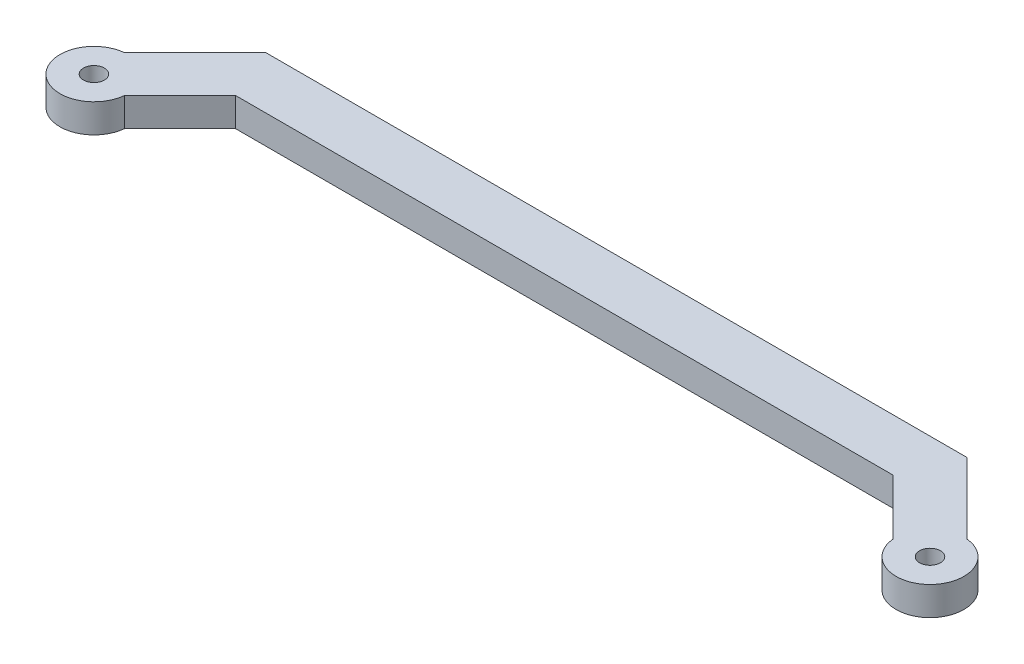
ISO-10303-21;
HEADER;
FILE_DESCRIPTION(('STEP AP214'),'2;1');
FILE_NAME('part.step','',(''),(''),'','','');
FILE_SCHEMA(('AUTOMOTIVE_DESIGN { 1 0 10303 214 1 1 1 1 }'));
ENDSEC;
DATA;
#1=APPLICATION_CONTEXT('core data for automotive mechanical design processes');
#2=APPLICATION_PROTOCOL_DEFINITION('international standard','automotive_design',2000,#1);
#3=PRODUCT_CONTEXT('',#1,'mechanical');
#4=PRODUCT('Part','Part','',(#3));
#5=PRODUCT_RELATED_PRODUCT_CATEGORY('part','',(#4));
#6=PRODUCT_DEFINITION_FORMATION('','',#4);
#7=PRODUCT_DEFINITION_CONTEXT('part definition',#1,'design');
#8=PRODUCT_DEFINITION('design','',#6,#7);
#9=PRODUCT_DEFINITION_SHAPE('','',#8);
#10=(LENGTH_UNIT() NAMED_UNIT(*) SI_UNIT(.MILLI.,.METRE.));
#11=(NAMED_UNIT(*) PLANE_ANGLE_UNIT() SI_UNIT($,.RADIAN.));
#12=(NAMED_UNIT(*) SI_UNIT($,.STERADIAN.) SOLID_ANGLE_UNIT());
#13=UNCERTAINTY_MEASURE_WITH_UNIT(LENGTH_MEASURE(1.E-05),#10,'distance_accuracy_value','');
#14=(GEOMETRIC_REPRESENTATION_CONTEXT(3) GLOBAL_UNCERTAINTY_ASSIGNED_CONTEXT((#13)) GLOBAL_UNIT_ASSIGNED_CONTEXT((#10,
#11,#12)) REPRESENTATION_CONTEXT('',''));
#15=CARTESIAN_POINT('',(0.,0.,0.));
#16=DIRECTION('',(0.,0.,1.));
#17=DIRECTION('',(1.,0.,0.));
#18=AXIS2_PLACEMENT_3D('',#15,#16,#17);
#19=CARTESIAN_POINT('',(-80.,5.5,10.));
#20=DIRECTION('',(0.,-1.,0.));
#21=DIRECTION('',(0.,0.,-1.));
#22=AXIS2_PLACEMENT_3D('',#19,#20,#21);
#23=PLANE('',#22);
#24=CARTESIAN_POINT('',(-80.,5.5,10.));
#25=DIRECTION('',(0.,-1.,0.));
#26=DIRECTION('',(0.,0.,-1.));
#27=AXIS2_PLACEMENT_3D('',#24,#25,#26);
#28=CIRCLE('',#27,2.);
#29=CARTESIAN_POINT('',(-80.,5.5,8.00000000000001));
#30=VERTEX_POINT('',#29);
#31=EDGE_CURVE('E191',#30,#30,#28,.T.);
#32=ORIENTED_EDGE('',*,*,#31,.T.);
#33=EDGE_LOOP('',(#32));
#34=FACE_BOUND('',#33,.T.);
#35=DIRECTION('',(-0.707106781186546,0.,0.707106781186549));
#36=VECTOR('',#35,1.);
#37=CARTESIAN_POINT('',(-62.9289321881346,5.5,0.));
#38=LINE('',#37,#36);
#39=CARTESIAN_POINT('',(-62.9289321881346,5.5,0.));
#40=VERTEX_POINT('',#39);
#41=CARTESIAN_POINT('',(-73.5276310629496,5.5,10.598698874815));
#42=VERTEX_POINT('',#41);
#43=EDGE_CURVE('E205',#40,#42,#38,.T.);
#44=ORIENTED_EDGE('',*,*,#43,.F.);
#45=DIRECTION('',(1.,0.,0.));
#46=VECTOR('',#45,1.);
#47=CARTESIAN_POINT('',(-62.9289321881346,5.5,0.));
#48=LINE('',#47,#46);
#49=CARTESIAN_POINT('',(62.9289321881346,5.5,0.));
#50=VERTEX_POINT('',#49);
#51=EDGE_CURVE('E165',#40,#50,#48,.T.);
#52=ORIENTED_EDGE('',*,*,#51,.T.);
#53=DIRECTION('',(0.707106781186546,0.,0.707106781186549));
#54=VECTOR('',#53,1.);
#55=CARTESIAN_POINT('',(62.9289321881346,5.5,0.));
#56=LINE('',#55,#54);
#57=CARTESIAN_POINT('',(73.5276310629496,5.5,10.598698874815));
#58=VERTEX_POINT('',#57);
#59=EDGE_CURVE('E157',#50,#58,#56,.T.);
#60=ORIENTED_EDGE('',*,*,#59,.T.);
#61=CARTESIAN_POINT('',(80.,5.5,9.99999999999999));
#62=DIRECTION('',(0.,1.,0.));
#63=DIRECTION('',(0.,0.,1.));
#64=AXIS2_PLACEMENT_3D('',#61,#62,#63);
#65=CIRCLE('',#64,6.5);
#66=CARTESIAN_POINT('',(80.5986988748151,5.5,3.52763106294957));
#67=VERTEX_POINT('',#66);
#68=EDGE_CURVE('E163',#58,#67,#65,.T.);
#69=ORIENTED_EDGE('',*,*,#68,.T.);
#70=DIRECTION('',(0.707106781186547,0.,0.707106781186548));
#71=VECTOR('',#70,1.);
#72=CARTESIAN_POINT('',(67.0710678118655,5.5,-10.));
#73=LINE('',#72,#71);
#74=CARTESIAN_POINT('',(67.0710678118655,5.5,-10.));
#75=VERTEX_POINT('',#74);
#76=EDGE_CURVE('E180',#75,#67,#73,.T.);
#77=ORIENTED_EDGE('',*,*,#76,.F.);
#78=DIRECTION('',(-1.,0.,0.));
#79=VECTOR('',#78,1.);
#80=CARTESIAN_POINT('',(67.0710678118655,5.5,-10.));
#81=LINE('',#80,#79);
#82=CARTESIAN_POINT('',(-67.0710678118655,5.5,-9.99999999999999));
#83=VERTEX_POINT('',#82);
#84=EDGE_CURVE('E182',#75,#83,#81,.T.);
#85=ORIENTED_EDGE('',*,*,#84,.T.);
#86=DIRECTION('',(-0.707106781186547,0.,0.707106781186548));
#87=VECTOR('',#86,1.);
#88=CARTESIAN_POINT('',(-67.0710678118655,5.5,-9.99999999999999));
#89=LINE('',#88,#87);
#90=CARTESIAN_POINT('',(-80.5986988748151,5.5,3.52763106294959));
#91=VERTEX_POINT('',#90);
#92=EDGE_CURVE('E227',#83,#91,#89,.T.);
#93=ORIENTED_EDGE('',*,*,#92,.T.);
#94=CARTESIAN_POINT('',(-80.,5.5,10.));
#95=DIRECTION('',(0.,-1.,0.));
#96=DIRECTION('',(0.,0.,-1.));
#97=AXIS2_PLACEMENT_3D('',#94,#95,#96);
#98=CIRCLE('',#97,6.5);
#99=EDGE_CURVE('E232',#42,#91,#98,.T.);
#100=ORIENTED_EDGE('',*,*,#99,.F.);
#101=EDGE_LOOP('',(#44,#52,#60,#69,#77,#85,#93,#100));
#102=FACE_BOUND('',#101,.T.);
#103=CARTESIAN_POINT('',(80.,5.5,9.99999999999999));
#104=DIRECTION('',(0.,1.,0.));
#105=DIRECTION('',(0.,0.,1.));
#106=AXIS2_PLACEMENT_3D('',#103,#104,#105);
#107=CIRCLE('',#106,2.);
#108=CARTESIAN_POINT('',(80.,5.5,12.));
#109=VERTEX_POINT('',#108);
#110=EDGE_CURVE('E240',#109,#109,#107,.T.);
#111=ORIENTED_EDGE('',*,*,#110,.F.);
#112=EDGE_LOOP('',(#111));
#113=FACE_BOUND('',#112,.T.);
#114=ADVANCED_FACE('F87',(#34,#102,#113),#23,.F.);
#115=CARTESIAN_POINT('',(-80.,0.,10.));
#116=DIRECTION('',(0.,-1.,0.));
#117=DIRECTION('',(0.,0.,-1.));
#118=AXIS2_PLACEMENT_3D('',#115,#116,#117);
#119=PLANE('',#118);
#120=DIRECTION('',(-0.707106781186546,0.,0.707106781186549));
#121=VECTOR('',#120,1.);
#122=CARTESIAN_POINT('',(-62.9289321881346,0.,0.));
#123=LINE('',#122,#121);
#124=CARTESIAN_POINT('',(-62.9289321881346,0.,0.));
#125=VERTEX_POINT('',#124);
#126=CARTESIAN_POINT('',(-73.5276310629496,0.,10.598698874815));
#127=VERTEX_POINT('',#126);
#128=EDGE_CURVE('E187',#125,#127,#123,.T.);
#129=ORIENTED_EDGE('',*,*,#128,.T.);
#130=CARTESIAN_POINT('',(-80.,0.,10.));
#131=DIRECTION('',(0.,-1.,0.));
#132=DIRECTION('',(0.,0.,-1.));
#133=AXIS2_PLACEMENT_3D('',#130,#131,#132);
#134=CIRCLE('',#133,6.5);
#135=CARTESIAN_POINT('',(-80.5986988748151,0.,3.52763106294959));
#136=VERTEX_POINT('',#135);
#137=EDGE_CURVE('E190',#127,#136,#134,.T.);
#138=ORIENTED_EDGE('',*,*,#137,.T.);
#139=DIRECTION('',(-0.707106781186547,0.,0.707106781186548));
#140=VECTOR('',#139,1.);
#141=CARTESIAN_POINT('',(-67.0710678118655,0.,-9.99999999999999));
#142=LINE('',#141,#140);
#143=CARTESIAN_POINT('',(-67.0710678118655,0.,-9.99999999999999));
#144=VERTEX_POINT('',#143);
#145=EDGE_CURVE('E194',#144,#136,#142,.T.);
#146=ORIENTED_EDGE('',*,*,#145,.F.);
#147=DIRECTION('',(-1.,0.,0.));
#148=VECTOR('',#147,1.);
#149=CARTESIAN_POINT('',(67.0710678118655,0.,-10.));
#150=LINE('',#149,#148);
#151=CARTESIAN_POINT('',(67.0710678118655,0.,-10.));
#152=VERTEX_POINT('',#151);
#153=EDGE_CURVE('E197',#152,#144,#150,.T.);
#154=ORIENTED_EDGE('',*,*,#153,.F.);
#155=DIRECTION('',(0.707106781186547,0.,0.707106781186548));
#156=VECTOR('',#155,1.);
#157=CARTESIAN_POINT('',(67.0710678118655,0.,-10.));
#158=LINE('',#157,#156);
#159=CARTESIAN_POINT('',(80.5986988748151,0.,3.52763106294957));
#160=VERTEX_POINT('',#159);
#161=EDGE_CURVE('E199',#152,#160,#158,.T.);
#162=ORIENTED_EDGE('',*,*,#161,.T.);
#163=CARTESIAN_POINT('',(80.,0.,9.99999999999999));
#164=DIRECTION('',(0.,1.,0.));
#165=DIRECTION('',(0.,0.,1.));
#166=AXIS2_PLACEMENT_3D('',#163,#164,#165);
#167=CIRCLE('',#166,6.5);
#168=CARTESIAN_POINT('',(73.5276310629496,0.,10.598698874815));
#169=VERTEX_POINT('',#168);
#170=EDGE_CURVE('E202',#169,#160,#167,.T.);
#171=ORIENTED_EDGE('',*,*,#170,.F.);
#172=DIRECTION('',(0.707106781186546,0.,0.707106781186549));
#173=VECTOR('',#172,1.);
#174=CARTESIAN_POINT('',(62.9289321881346,0.,0.));
#175=LINE('',#174,#173);
#176=CARTESIAN_POINT('',(62.9289321881346,0.,0.));
#177=VERTEX_POINT('',#176);
#178=EDGE_CURVE('E172',#177,#169,#175,.T.);
#179=ORIENTED_EDGE('',*,*,#178,.F.);
#180=DIRECTION('',(1.,0.,0.));
#181=VECTOR('',#180,1.);
#182=CARTESIAN_POINT('',(-62.9289321881346,0.,0.));
#183=LINE('',#182,#181);
#184=EDGE_CURVE('E133',#125,#177,#183,.T.);
#185=ORIENTED_EDGE('',*,*,#184,.F.);
#186=EDGE_LOOP('',(#129,#138,#146,#154,#162,#171,#179,#185));
#187=FACE_BOUND('',#186,.T.);
#188=CARTESIAN_POINT('',(-80.,0.,10.));
#189=DIRECTION('',(0.,-1.,0.));
#190=DIRECTION('',(0.,0.,-1.));
#191=AXIS2_PLACEMENT_3D('',#188,#189,#190);
#192=CIRCLE('',#191,2.);
#193=CARTESIAN_POINT('',(-80.,0.,8.00000000000001));
#194=VERTEX_POINT('',#193);
#195=EDGE_CURVE('E237',#194,#194,#192,.T.);
#196=ORIENTED_EDGE('',*,*,#195,.F.);
#197=EDGE_LOOP('',(#196));
#198=FACE_BOUND('',#197,.T.);
#199=CARTESIAN_POINT('',(80.,0.,9.99999999999999));
#200=DIRECTION('',(0.,1.,0.));
#201=DIRECTION('',(0.,0.,1.));
#202=AXIS2_PLACEMENT_3D('',#199,#200,#201);
#203=CIRCLE('',#202,2.);
#204=CARTESIAN_POINT('',(80.,0.,12.));
#205=VERTEX_POINT('',#204);
#206=EDGE_CURVE('E243',#205,#205,#203,.T.);
#207=ORIENTED_EDGE('',*,*,#206,.T.);
#208=EDGE_LOOP('',(#207));
#209=FACE_BOUND('',#208,.T.);
#210=ADVANCED_FACE('F218',(#187,#198,#209),#119,.T.);
#211=CARTESIAN_POINT('',(-62.9289321881346,5.5,0.));
#212=DIRECTION('',(0.707106781186549,0.,0.707106781186546));
#213=DIRECTION('',(0.707106781186546,0.,-0.707106781186549));
#214=AXIS2_PLACEMENT_3D('',#211,#212,#213);
#215=PLANE('',#214);
#216=ORIENTED_EDGE('',*,*,#128,.F.);
#217=DIRECTION('',(0.,-1.,0.));
#218=VECTOR('',#217,1.);
#219=CARTESIAN_POINT('',(-62.9289321881346,5.5,0.));
#220=LINE('',#219,#218);
#221=EDGE_CURVE('E12',#40,#125,#220,.T.);
#222=ORIENTED_EDGE('',*,*,#221,.F.);
#223=ORIENTED_EDGE('',*,*,#43,.T.);
#224=DIRECTION('',(0.,-1.,0.));
#225=VECTOR('',#224,1.);
#226=CARTESIAN_POINT('',(-73.5276310629496,5.5,10.598698874815));
#227=LINE('',#226,#225);
#228=EDGE_CURVE('E91',#42,#127,#227,.T.);
#229=ORIENTED_EDGE('',*,*,#228,.T.);
#230=EDGE_LOOP('',(#216,#222,#223,#229));
#231=FACE_BOUND('',#230,.T.);
#232=ADVANCED_FACE('F89',(#231),#215,.T.);
#233=CARTESIAN_POINT('',(-62.9289321881346,5.5,0.));
#234=DIRECTION('',(0.,0.,-1.));
#235=DIRECTION('',(-1.,0.,0.));
#236=AXIS2_PLACEMENT_3D('',#233,#234,#235);
#237=PLANE('',#236);
#238=ORIENTED_EDGE('',*,*,#184,.T.);
#239=DIRECTION('',(0.,-1.,0.));
#240=VECTOR('',#239,1.);
#241=CARTESIAN_POINT('',(62.9289321881346,5.5,0.));
#242=LINE('',#241,#240);
#243=EDGE_CURVE('E97',#50,#177,#242,.T.);
#244=ORIENTED_EDGE('',*,*,#243,.F.);
#245=ORIENTED_EDGE('',*,*,#51,.F.);
#246=ORIENTED_EDGE('',*,*,#221,.T.);
#247=EDGE_LOOP('',(#238,#244,#245,#246));
#248=FACE_BOUND('',#247,.T.);
#249=ADVANCED_FACE('F262',(#248),#237,.F.);
#250=CARTESIAN_POINT('',(62.9289321881346,5.5,0.));
#251=DIRECTION('',(0.707106781186549,0.,-0.707106781186546));
#252=DIRECTION('',(-0.707106781186546,0.,-0.707106781186549));
#253=AXIS2_PLACEMENT_3D('',#250,#251,#252);
#254=PLANE('',#253);
#255=ORIENTED_EDGE('',*,*,#178,.T.);
#256=DIRECTION('',(0.,-1.,0.));
#257=VECTOR('',#256,1.);
#258=CARTESIAN_POINT('',(73.5276310629496,5.5,10.598698874815));
#259=LINE('',#258,#257);
#260=EDGE_CURVE('E169',#58,#169,#259,.T.);
#261=ORIENTED_EDGE('',*,*,#260,.F.);
#262=ORIENTED_EDGE('',*,*,#59,.F.);
#263=ORIENTED_EDGE('',*,*,#243,.T.);
#264=EDGE_LOOP('',(#255,#261,#262,#263));
#265=FACE_BOUND('',#264,.T.);
#266=ADVANCED_FACE('F170',(#265),#254,.F.);
#267=CARTESIAN_POINT('',(80.,5.5,9.99999999999999));
#268=DIRECTION('',(0.,-1.,0.));
#269=DIRECTION('',(0.,0.,-1.));
#270=AXIS2_PLACEMENT_3D('',#267,#268,#269);
#271=CYLINDRICAL_SURFACE('',#270,6.5);
#272=ORIENTED_EDGE('',*,*,#170,.T.);
#273=DIRECTION('',(0.,-1.,0.));
#274=VECTOR('',#273,1.);
#275=CARTESIAN_POINT('',(80.5986988748151,5.5,3.52763106294957));
#276=LINE('',#275,#274);
#277=EDGE_CURVE('E176',#67,#160,#276,.T.);
#278=ORIENTED_EDGE('',*,*,#277,.F.);
#279=ORIENTED_EDGE('',*,*,#68,.F.);
#280=ORIENTED_EDGE('',*,*,#260,.T.);
#281=EDGE_LOOP('',(#272,#278,#279,#280));
#282=FACE_BOUND('',#281,.T.);
#283=ADVANCED_FACE('F178',(#282),#271,.T.);
#284=CARTESIAN_POINT('',(67.0710678118655,5.5,-10.));
#285=DIRECTION('',(0.707106781186548,0.,-0.707106781186547));
#286=DIRECTION('',(-0.707106781186547,0.,-0.707106781186548));
#287=AXIS2_PLACEMENT_3D('',#284,#285,#286);
#288=PLANE('',#287);
#289=ORIENTED_EDGE('',*,*,#161,.F.);
#290=DIRECTION('',(0.,-1.,0.));
#291=VECTOR('',#290,1.);
#292=CARTESIAN_POINT('',(67.0710678118655,5.5,-10.));
#293=LINE('',#292,#291);
#294=EDGE_CURVE('E209',#75,#152,#293,.T.);
#295=ORIENTED_EDGE('',*,*,#294,.F.);
#296=ORIENTED_EDGE('',*,*,#76,.T.);
#297=ORIENTED_EDGE('',*,*,#277,.T.);
#298=EDGE_LOOP('',(#289,#295,#296,#297));
#299=FACE_BOUND('',#298,.T.);
#300=ADVANCED_FACE('F223',(#299),#288,.T.);
#301=CARTESIAN_POINT('',(67.0710678118655,5.5,-10.));
#302=DIRECTION('',(0.,0.,1.));
#303=DIRECTION('',(1.,0.,0.));
#304=AXIS2_PLACEMENT_3D('',#301,#302,#303);
#305=PLANE('',#304);
#306=ORIENTED_EDGE('',*,*,#153,.T.);
#307=DIRECTION('',(0.,-1.,0.));
#308=VECTOR('',#307,1.);
#309=CARTESIAN_POINT('',(-67.0710678118655,5.5,-9.99999999999999));
#310=LINE('',#309,#308);
#311=EDGE_CURVE('E211',#83,#144,#310,.T.);
#312=ORIENTED_EDGE('',*,*,#311,.F.);
#313=ORIENTED_EDGE('',*,*,#84,.F.);
#314=ORIENTED_EDGE('',*,*,#294,.T.);
#315=EDGE_LOOP('',(#306,#312,#313,#314));
#316=FACE_BOUND('',#315,.T.);
#317=ADVANCED_FACE('F229',(#316),#305,.F.);
#318=CARTESIAN_POINT('',(-67.0710678118655,5.5,-9.99999999999999));
#319=DIRECTION('',(0.707106781186548,0.,0.707106781186547));
#320=DIRECTION('',(0.707106781186547,0.,-0.707106781186548));
#321=AXIS2_PLACEMENT_3D('',#318,#319,#320);
#322=PLANE('',#321);
#323=ORIENTED_EDGE('',*,*,#145,.T.);
#324=DIRECTION('',(0.,-1.,0.));
#325=VECTOR('',#324,1.);
#326=CARTESIAN_POINT('',(-80.5986988748151,5.5,3.52763106294959));
#327=LINE('',#326,#325);
#328=EDGE_CURVE('E213',#91,#136,#327,.T.);
#329=ORIENTED_EDGE('',*,*,#328,.F.);
#330=ORIENTED_EDGE('',*,*,#92,.F.);
#331=ORIENTED_EDGE('',*,*,#311,.T.);
#332=EDGE_LOOP('',(#323,#329,#330,#331));
#333=FACE_BOUND('',#332,.T.);
#334=ADVANCED_FACE('F231',(#333),#322,.F.);
#335=CARTESIAN_POINT('',(-80.,5.5,10.));
#336=DIRECTION('',(0.,-1.,0.));
#337=DIRECTION('',(0.,0.,-1.));
#338=AXIS2_PLACEMENT_3D('',#335,#336,#337);
#339=CYLINDRICAL_SURFACE('',#338,6.5);
#340=ORIENTED_EDGE('',*,*,#137,.F.);
#341=ORIENTED_EDGE('',*,*,#228,.F.);
#342=ORIENTED_EDGE('',*,*,#99,.T.);
#343=ORIENTED_EDGE('',*,*,#328,.T.);
#344=EDGE_LOOP('',(#340,#341,#342,#343));
#345=FACE_BOUND('',#344,.T.);
#346=ADVANCED_FACE('F215',(#345),#339,.T.);
#347=CARTESIAN_POINT('',(-80.,5.5,10.));
#348=DIRECTION('',(0.,-1.,0.));
#349=DIRECTION('',(0.,0.,-1.));
#350=AXIS2_PLACEMENT_3D('',#347,#348,#349);
#351=CYLINDRICAL_SURFACE('',#350,2.);
#352=ORIENTED_EDGE('',*,*,#31,.F.);
#353=EDGE_LOOP('',(#352));
#354=FACE_BOUND('',#353,.T.);
#355=ORIENTED_EDGE('',*,*,#195,.T.);
#356=EDGE_LOOP('',(#355));
#357=FACE_BOUND('',#356,.T.);
#358=ADVANCED_FACE('F259',(#354,#357),#351,.F.);
#359=CARTESIAN_POINT('',(80.,5.5,9.99999999999999));
#360=DIRECTION('',(0.,-1.,0.));
#361=DIRECTION('',(0.,0.,-1.));
#362=AXIS2_PLACEMENT_3D('',#359,#360,#361);
#363=CYLINDRICAL_SURFACE('',#362,2.);
#364=ORIENTED_EDGE('',*,*,#110,.T.);
#365=EDGE_LOOP('',(#364));
#366=FACE_BOUND('',#365,.T.);
#367=ORIENTED_EDGE('',*,*,#206,.F.);
#368=EDGE_LOOP('',(#367));
#369=FACE_BOUND('',#368,.T.);
#370=ADVANCED_FACE('F249',(#366,#369),#363,.F.);
#371=CLOSED_SHELL('',(#114,#210,#232,#249,#266,#283,#300,#317,#334,#346,#358,#370));
#372=MANIFOLD_SOLID_BREP('B2',#371);
#373=ADVANCED_BREP_SHAPE_REPRESENTATION('',(#18,#372),#14);
#374=SHAPE_DEFINITION_REPRESENTATION(#9,#373);
ENDSEC;
END-ISO-10303-21;
